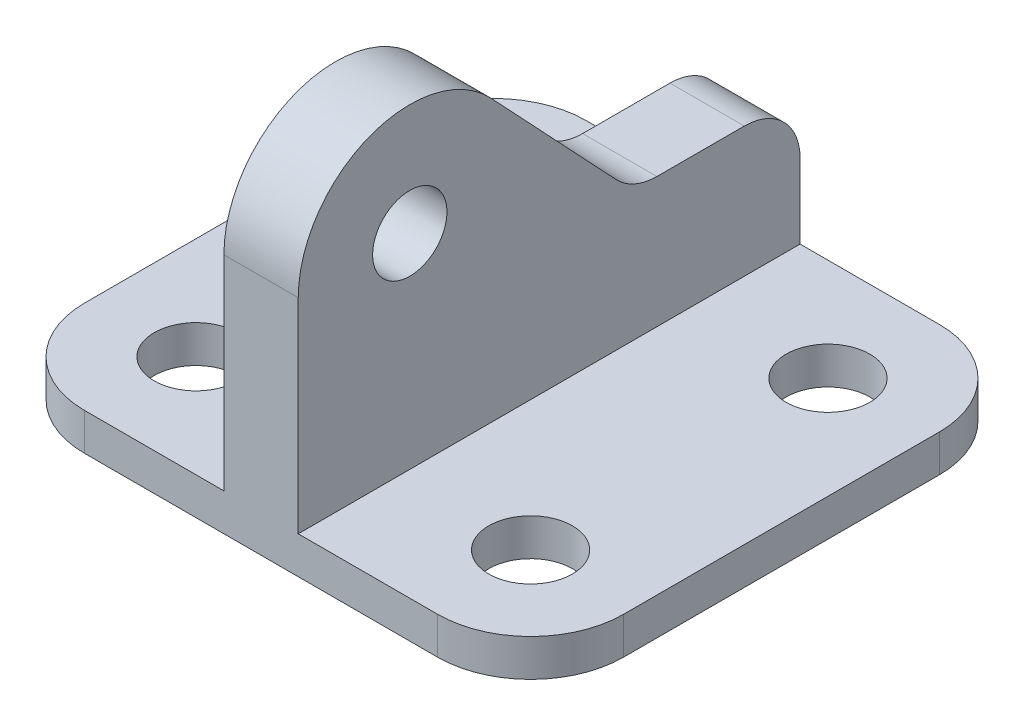
ISO-10303-21;
HEADER;
FILE_DESCRIPTION(('STEP AP214'),'2;1');
FILE_NAME('part.step','',(''),(''),'','','');
FILE_SCHEMA(('AUTOMOTIVE_DESIGN { 1 0 10303 214 1 1 1 1 }'));
ENDSEC;
DATA;
#1=APPLICATION_CONTEXT('core data for automotive mechanical design processes');
#2=APPLICATION_PROTOCOL_DEFINITION('international standard','automotive_design',2000,#1);
#3=PRODUCT_CONTEXT('',#1,'mechanical');
#4=PRODUCT('Part','Part','',(#3));
#5=PRODUCT_RELATED_PRODUCT_CATEGORY('part','',(#4));
#6=PRODUCT_DEFINITION_FORMATION('','',#4);
#7=PRODUCT_DEFINITION_CONTEXT('part definition',#1,'design');
#8=PRODUCT_DEFINITION('design','',#6,#7);
#9=PRODUCT_DEFINITION_SHAPE('','',#8);
#10=(LENGTH_UNIT() NAMED_UNIT(*) SI_UNIT(.MILLI.,.METRE.));
#11=(NAMED_UNIT(*) PLANE_ANGLE_UNIT() SI_UNIT($,.RADIAN.));
#12=(NAMED_UNIT(*) SI_UNIT($,.STERADIAN.) SOLID_ANGLE_UNIT());
#13=UNCERTAINTY_MEASURE_WITH_UNIT(LENGTH_MEASURE(1.E-05),#10,'distance_accuracy_value','');
#14=(GEOMETRIC_REPRESENTATION_CONTEXT(3) GLOBAL_UNCERTAINTY_ASSIGNED_CONTEXT((#13)) GLOBAL_UNIT_ASSIGNED_CONTEXT((#10,
#11,#12)) REPRESENTATION_CONTEXT('',''));
#15=CARTESIAN_POINT('',(0.,0.,0.));
#16=DIRECTION('',(0.,0.,1.));
#17=DIRECTION('',(1.,0.,0.));
#18=AXIS2_PLACEMENT_3D('',#15,#16,#17);
#19=CARTESIAN_POINT('',(0.,2.,27.));
#20=DIRECTION('',(1.,0.,0.));
#21=DIRECTION('',(0.,1.,0.));
#22=AXIS2_PLACEMENT_3D('',#19,#20,#21);
#23=PLANE('',#22);
#24=DIRECTION('',(0.,0.,-1.));
#25=VECTOR('',#24,1.);
#26=CARTESIAN_POINT('',(0.,2.,27.));
#27=LINE('',#26,#25);
#28=CARTESIAN_POINT('',(0.,2.,22.));
#29=VERTEX_POINT('',#28);
#30=CARTESIAN_POINT('',(0.,2.,5.));
#31=VERTEX_POINT('',#30);
#32=EDGE_CURVE('E208',#29,#31,#27,.T.);
#33=ORIENTED_EDGE('',*,*,#32,.T.);
#34=DIRECTION('',(0.,-1.,0.));
#35=VECTOR('',#34,1.);
#36=CARTESIAN_POINT('',(0.,2.,5.));
#37=LINE('',#36,#35);
#38=CARTESIAN_POINT('',(0.,0.,5.));
#39=VERTEX_POINT('',#38);
#40=EDGE_CURVE('E240',#31,#39,#37,.T.);
#41=ORIENTED_EDGE('',*,*,#40,.T.);
#42=DIRECTION('',(0.,0.,-1.));
#43=VECTOR('',#42,1.);
#44=CARTESIAN_POINT('',(0.,0.,27.));
#45=LINE('',#44,#43);
#46=CARTESIAN_POINT('',(0.,0.,22.));
#47=VERTEX_POINT('',#46);
#48=EDGE_CURVE('E235',#47,#39,#45,.T.);
#49=ORIENTED_EDGE('',*,*,#48,.F.);
#50=DIRECTION('',(0.,-1.,0.));
#51=VECTOR('',#50,1.);
#52=CARTESIAN_POINT('',(0.,2.,22.));
#53=LINE('',#52,#51);
#54=EDGE_CURVE('E238',#47,#29,#53,.F.);
#55=ORIENTED_EDGE('',*,*,#54,.T.);
#56=EDGE_LOOP('',(#33,#41,#49,#55));
#57=FACE_BOUND('',#56,.T.);
#58=ADVANCED_FACE('F33',(#57),#23,.F.);
#59=CARTESIAN_POINT('',(0.,0.,27.));
#60=DIRECTION('',(0.,1.,0.));
#61=DIRECTION('',(0.,0.,1.));
#62=AXIS2_PLACEMENT_3D('',#59,#60,#61);
#63=PLANE('',#62);
#64=CARTESIAN_POINT('',(23.5,0.,21.5));
#65=DIRECTION('',(0.,-1.,0.));
#66=DIRECTION('',(0.,0.,-1.));
#67=AXIS2_PLACEMENT_3D('',#64,#65,#66);
#68=CIRCLE('',#67,2.25);
#69=CARTESIAN_POINT('',(23.5,0.,19.25));
#70=VERTEX_POINT('',#69);
#71=EDGE_CURVE('E179',#70,#70,#68,.T.);
#72=ORIENTED_EDGE('',*,*,#71,.F.);
#73=EDGE_LOOP('',(#72));
#74=FACE_BOUND('',#73,.T.);
#75=CARTESIAN_POINT('',(23.5,0.,5.5));
#76=DIRECTION('',(0.,-1.,0.));
#77=DIRECTION('',(0.,0.,-1.));
#78=AXIS2_PLACEMENT_3D('',#75,#76,#77);
#79=CIRCLE('',#78,2.25);
#80=CARTESIAN_POINT('',(23.5,0.,3.25));
#81=VERTEX_POINT('',#80);
#82=EDGE_CURVE('E183',#81,#81,#79,.T.);
#83=ORIENTED_EDGE('',*,*,#82,.F.);
#84=EDGE_LOOP('',(#83));
#85=FACE_BOUND('',#84,.T.);
#86=CARTESIAN_POINT('',(5.5,0.,5.5));
#87=DIRECTION('',(0.,-1.,0.));
#88=DIRECTION('',(0.,0.,-1.));
#89=AXIS2_PLACEMENT_3D('',#86,#87,#88);
#90=CIRCLE('',#89,2.25);
#91=CARTESIAN_POINT('',(5.5,0.,3.25));
#92=VERTEX_POINT('',#91);
#93=EDGE_CURVE('E187',#92,#92,#90,.T.);
#94=ORIENTED_EDGE('',*,*,#93,.F.);
#95=EDGE_LOOP('',(#94));
#96=FACE_BOUND('',#95,.T.);
#97=CARTESIAN_POINT('',(5.49999999999999,0.,21.5));
#98=DIRECTION('',(0.,-1.,0.));
#99=DIRECTION('',(0.,0.,-1.));
#100=AXIS2_PLACEMENT_3D('',#97,#98,#99);
#101=CIRCLE('',#100,2.25);
#102=CARTESIAN_POINT('',(5.49999999999999,0.,19.25));
#103=VERTEX_POINT('',#102);
#104=EDGE_CURVE('E191',#103,#103,#101,.T.);
#105=ORIENTED_EDGE('',*,*,#104,.F.);
#106=EDGE_LOOP('',(#105));
#107=FACE_BOUND('',#106,.T.);
#108=ORIENTED_EDGE('',*,*,#48,.T.);
#109=CARTESIAN_POINT('',(5.,0.,5.));
#110=DIRECTION('',(0.,1.,0.));
#111=DIRECTION('',(0.,0.,1.));
#112=AXIS2_PLACEMENT_3D('',#109,#110,#111);
#113=CIRCLE('',#112,5.);
#114=CARTESIAN_POINT('',(5.,0.,0.));
#115=VERTEX_POINT('',#114);
#116=EDGE_CURVE('E249',#39,#115,#113,.F.);
#117=ORIENTED_EDGE('',*,*,#116,.T.);
#118=DIRECTION('',(1.,0.,0.));
#119=VECTOR('',#118,1.);
#120=CARTESIAN_POINT('',(0.,0.,0.));
#121=LINE('',#120,#119);
#122=CARTESIAN_POINT('',(24.,0.,0.));
#123=VERTEX_POINT('',#122);
#124=EDGE_CURVE('E209',#115,#123,#121,.T.);
#125=ORIENTED_EDGE('',*,*,#124,.T.);
#126=CARTESIAN_POINT('',(24.,0.,5.));
#127=DIRECTION('',(0.,1.,0.));
#128=DIRECTION('',(0.,0.,1.));
#129=AXIS2_PLACEMENT_3D('',#126,#127,#128);
#130=CIRCLE('',#129,5.);
#131=CARTESIAN_POINT('',(29.,0.,5.));
#132=VERTEX_POINT('',#131);
#133=EDGE_CURVE('E247',#123,#132,#130,.F.);
#134=ORIENTED_EDGE('',*,*,#133,.T.);
#135=DIRECTION('',(0.,0.,-1.));
#136=VECTOR('',#135,1.);
#137=CARTESIAN_POINT('',(29.,0.,27.));
#138=LINE('',#137,#136);
#139=CARTESIAN_POINT('',(29.,0.,22.));
#140=VERTEX_POINT('',#139);
#141=EDGE_CURVE('E232',#140,#132,#138,.T.);
#142=ORIENTED_EDGE('',*,*,#141,.F.);
#143=CARTESIAN_POINT('',(24.,0.,22.));
#144=DIRECTION('',(0.,1.,0.));
#145=DIRECTION('',(0.,0.,1.));
#146=AXIS2_PLACEMENT_3D('',#143,#144,#145);
#147=CIRCLE('',#146,5.);
#148=CARTESIAN_POINT('',(24.,0.,27.));
#149=VERTEX_POINT('',#148);
#150=EDGE_CURVE('E245',#140,#149,#147,.F.);
#151=ORIENTED_EDGE('',*,*,#150,.T.);
#152=DIRECTION('',(1.,0.,0.));
#153=VECTOR('',#152,1.);
#154=CARTESIAN_POINT('',(0.,0.,27.));
#155=LINE('',#154,#153);
#156=CARTESIAN_POINT('',(5.,0.,27.));
#157=VERTEX_POINT('',#156);
#158=EDGE_CURVE('E195',#157,#149,#155,.T.);
#159=ORIENTED_EDGE('',*,*,#158,.F.);
#160=CARTESIAN_POINT('',(5.,0.,22.));
#161=DIRECTION('',(0.,1.,0.));
#162=DIRECTION('',(0.,0.,1.));
#163=AXIS2_PLACEMENT_3D('',#160,#161,#162);
#164=CIRCLE('',#163,5.);
#165=EDGE_CURVE('E243',#157,#47,#164,.F.);
#166=ORIENTED_EDGE('',*,*,#165,.T.);
#167=EDGE_LOOP('',(#108,#117,#125,#134,#142,#151,#159,#166));
#168=FACE_BOUND('',#167,.T.);
#169=ADVANCED_FACE('F321',(#74,#85,#96,#107,#168),#63,.F.);
#170=CARTESIAN_POINT('',(29.,0.,27.));
#171=DIRECTION('',(-1.,0.,0.));
#172=DIRECTION('',(0.,0.,1.));
#173=AXIS2_PLACEMENT_3D('',#170,#171,#172);
#174=PLANE('',#173);
#175=ORIENTED_EDGE('',*,*,#141,.T.);
#176=DIRECTION('',(0.,1.,0.));
#177=VECTOR('',#176,1.);
#178=CARTESIAN_POINT('',(29.,0.,5.));
#179=LINE('',#178,#177);
#180=CARTESIAN_POINT('',(29.,2.,5.));
#181=VERTEX_POINT('',#180);
#182=EDGE_CURVE('E261',#132,#181,#179,.T.);
#183=ORIENTED_EDGE('',*,*,#182,.T.);
#184=DIRECTION('',(0.,0.,-1.));
#185=VECTOR('',#184,1.);
#186=CARTESIAN_POINT('',(29.,2.,27.));
#187=LINE('',#186,#185);
#188=CARTESIAN_POINT('',(29.,2.,22.));
#189=VERTEX_POINT('',#188);
#190=EDGE_CURVE('E229',#189,#181,#187,.T.);
#191=ORIENTED_EDGE('',*,*,#190,.F.);
#192=DIRECTION('',(0.,1.,0.));
#193=VECTOR('',#192,1.);
#194=CARTESIAN_POINT('',(29.,0.,22.));
#195=LINE('',#194,#193);
#196=EDGE_CURVE('E259',#189,#140,#195,.F.);
#197=ORIENTED_EDGE('',*,*,#196,.T.);
#198=EDGE_LOOP('',(#175,#183,#191,#197));
#199=FACE_BOUND('',#198,.T.);
#200=ADVANCED_FACE('F324',(#199),#174,.F.);
#201=CARTESIAN_POINT('',(29.,2.,27.));
#202=DIRECTION('',(0.,-1.,0.));
#203=DIRECTION('',(1.,0.,0.));
#204=AXIS2_PLACEMENT_3D('',#201,#202,#203);
#205=PLANE('',#204);
#206=CARTESIAN_POINT('',(23.5,2.00000000000001,21.5));
#207=DIRECTION('',(0.,-1.,0.));
#208=DIRECTION('',(1.,0.,0.));
#209=AXIS2_PLACEMENT_3D('',#206,#207,#208);
#210=CIRCLE('',#209,2.25);
#211=CARTESIAN_POINT('',(25.75,2.00000000000001,21.5));
#212=VERTEX_POINT('',#211);
#213=EDGE_CURVE('E182',#212,#212,#210,.T.);
#214=ORIENTED_EDGE('',*,*,#213,.T.);
#215=EDGE_LOOP('',(#214));
#216=FACE_BOUND('',#215,.T.);
#217=CARTESIAN_POINT('',(23.5,2.00000000000001,5.5));
#218=DIRECTION('',(0.,-1.,0.));
#219=DIRECTION('',(1.,0.,0.));
#220=AXIS2_PLACEMENT_3D('',#217,#218,#219);
#221=CIRCLE('',#220,2.25);
#222=CARTESIAN_POINT('',(25.75,2.00000000000001,5.5));
#223=VERTEX_POINT('',#222);
#224=EDGE_CURVE('E186',#223,#223,#221,.T.);
#225=ORIENTED_EDGE('',*,*,#224,.T.);
#226=EDGE_LOOP('',(#225));
#227=FACE_BOUND('',#226,.T.);
#228=ORIENTED_EDGE('',*,*,#190,.T.);
#229=CARTESIAN_POINT('',(24.,2.,5.));
#230=DIRECTION('',(0.,-1.,0.));
#231=DIRECTION('',(1.,0.,0.));
#232=AXIS2_PLACEMENT_3D('',#229,#230,#231);
#233=CIRCLE('',#232,5.);
#234=CARTESIAN_POINT('',(24.,2.,0.));
#235=VERTEX_POINT('',#234);
#236=EDGE_CURVE('E266',#181,#235,#233,.F.);
#237=ORIENTED_EDGE('',*,*,#236,.T.);
#238=DIRECTION('',(-1.,0.,0.));
#239=VECTOR('',#238,1.);
#240=CARTESIAN_POINT('',(29.,2.,0.));
#241=LINE('',#240,#239);
#242=CARTESIAN_POINT('',(16.5,2.,0.));
#243=VERTEX_POINT('',#242);
#244=EDGE_CURVE('E212',#235,#243,#241,.T.);
#245=ORIENTED_EDGE('',*,*,#244,.T.);
#246=DIRECTION('',(0.,0.,-1.));
#247=VECTOR('',#246,1.);
#248=CARTESIAN_POINT('',(16.5,2.,27.));
#249=LINE('',#248,#247);
#250=CARTESIAN_POINT('',(16.5,2.,27.));
#251=VERTEX_POINT('',#250);
#252=EDGE_CURVE('E226',#251,#243,#249,.T.);
#253=ORIENTED_EDGE('',*,*,#252,.F.);
#254=DIRECTION('',(-1.,0.,0.));
#255=VECTOR('',#254,1.);
#256=CARTESIAN_POINT('',(29.,2.,27.));
#257=LINE('',#256,#255);
#258=CARTESIAN_POINT('',(24.,2.,27.));
#259=VERTEX_POINT('',#258);
#260=EDGE_CURVE('E198',#259,#251,#257,.T.);
#261=ORIENTED_EDGE('',*,*,#260,.F.);
#262=CARTESIAN_POINT('',(24.,2.,22.));
#263=DIRECTION('',(0.,-1.,0.));
#264=DIRECTION('',(1.,0.,0.));
#265=AXIS2_PLACEMENT_3D('',#262,#263,#264);
#266=CIRCLE('',#265,5.);
#267=EDGE_CURVE('E264',#259,#189,#266,.F.);
#268=ORIENTED_EDGE('',*,*,#267,.T.);
#269=EDGE_LOOP('',(#228,#237,#245,#253,#261,#268));
#270=FACE_BOUND('',#269,.T.);
#271=ADVANCED_FACE('F312',(#216,#227,#270),#205,.F.);
#272=CARTESIAN_POINT('',(16.5,2.,27.));
#273=DIRECTION('',(-1.,0.,0.));
#274=DIRECTION('',(0.,0.,1.));
#275=AXIS2_PLACEMENT_3D('',#272,#273,#274);
#276=PLANE('',#275);
#277=CARTESIAN_POINT('',(16.5,13.,21.));
#278=DIRECTION('',(-1.,0.,0.));
#279=DIRECTION('',(0.,0.,1.));
#280=AXIS2_PLACEMENT_3D('',#277,#278,#279);
#281=CIRCLE('',#280,2.);
#282=CARTESIAN_POINT('',(16.5,13.,23.));
#283=VERTEX_POINT('',#282);
#284=EDGE_CURVE('E298',#283,#283,#281,.T.);
#285=ORIENTED_EDGE('',*,*,#284,.T.);
#286=EDGE_LOOP('',(#285));
#287=FACE_BOUND('',#286,.T.);
#288=DIRECTION('',(0.,1.,0.));
#289=VECTOR('',#288,1.);
#290=CARTESIAN_POINT('',(16.5,2.,0.));
#291=LINE('',#290,#289);
#292=CARTESIAN_POINT('',(16.5,6.,0.));
#293=VERTEX_POINT('',#292);
#294=EDGE_CURVE('E214',#243,#293,#291,.T.);
#295=ORIENTED_EDGE('',*,*,#294,.T.);
#296=CARTESIAN_POINT('',(16.5,6.,3.));
#297=DIRECTION('',(-1.,0.,0.));
#298=DIRECTION('',(0.,0.,1.));
#299=AXIS2_PLACEMENT_3D('',#296,#297,#298);
#300=CIRCLE('',#299,3.);
#301=CARTESIAN_POINT('',(16.5,9.,3.));
#302=VERTEX_POINT('',#301);
#303=EDGE_CURVE('E48',#293,#302,#300,.F.);
#304=ORIENTED_EDGE('',*,*,#303,.T.);
#305=DIRECTION('',(0.,0.,1.));
#306=VECTOR('',#305,1.);
#307=CARTESIAN_POINT('',(16.5,9.,27.));
#308=LINE('',#307,#306);
#309=CARTESIAN_POINT('',(16.5,9.,7.70329308849007));
#310=VERTEX_POINT('',#309);
#311=EDGE_CURVE('E165',#302,#310,#308,.T.);
#312=ORIENTED_EDGE('',*,*,#311,.T.);
#313=CARTESIAN_POINT('',(16.5,12.,7.70329308849007));
#314=DIRECTION('',(-1.,0.,0.));
#315=DIRECTION('',(0.,0.,1.));
#316=AXIS2_PLACEMENT_3D('',#313,#314,#315);
#317=CIRCLE('',#316,3.);
#318=CARTESIAN_POINT('',(16.5,9.94450603672649,9.88845774291457));
#319=VERTEX_POINT('',#318);
#320=EDGE_CURVE('E11',#310,#319,#317,.T.);
#321=ORIENTED_EDGE('',*,*,#320,.T.);
#322=DIRECTION('',(0.,0.728388218141501,0.685164654424503));
#323=VECTOR('',#322,1.);
#324=CARTESIAN_POINT('',(16.5,14.269339737565,13.9566498337191));
#325=LINE('',#324,#323);
#326=CARTESIAN_POINT('',(16.5,17.110987926547,16.629670691151));
#327=VERTEX_POINT('',#326);
#328=EDGE_CURVE('E177',#319,#327,#325,.T.);
#329=ORIENTED_EDGE('',*,*,#328,.T.);
#330=CARTESIAN_POINT('',(16.5,13.,21.));
#331=DIRECTION('',(-1.,0.,0.));
#332=DIRECTION('',(0.,0.,1.));
#333=AXIS2_PLACEMENT_3D('',#330,#331,#332);
#334=CIRCLE('',#333,6.);
#335=CARTESIAN_POINT('',(16.5,13.,27.));
#336=VERTEX_POINT('',#335);
#337=EDGE_CURVE('E164',#327,#336,#334,.F.);
#338=ORIENTED_EDGE('',*,*,#337,.T.);
#339=DIRECTION('',(0.,1.,0.));
#340=VECTOR('',#339,1.);
#341=CARTESIAN_POINT('',(16.5,2.,27.));
#342=LINE('',#341,#340);
#343=EDGE_CURVE('E201',#251,#336,#342,.T.);
#344=ORIENTED_EDGE('',*,*,#343,.F.);
#345=ORIENTED_EDGE('',*,*,#252,.T.);
#346=EDGE_LOOP('',(#295,#304,#312,#321,#329,#338,#344,#345));
#347=FACE_BOUND('',#346,.T.);
#348=ADVANCED_FACE('F302',(#287,#347),#276,.F.);
#349=CARTESIAN_POINT('',(12.5,19.,27.));
#350=DIRECTION('',(1.,0.,0.));
#351=DIRECTION('',(0.,0.,-1.));
#352=AXIS2_PLACEMENT_3D('',#349,#350,#351);
#353=PLANE('',#352);
#354=CARTESIAN_POINT('',(12.5,13.,21.));
#355=DIRECTION('',(-1.,0.,0.));
#356=DIRECTION('',(0.,0.,1.));
#357=AXIS2_PLACEMENT_3D('',#354,#355,#356);
#358=CIRCLE('',#357,2.);
#359=CARTESIAN_POINT('',(12.5,13.,23.));
#360=VERTEX_POINT('',#359);
#361=EDGE_CURVE('E555',#360,#360,#358,.T.);
#362=ORIENTED_EDGE('',*,*,#361,.F.);
#363=EDGE_LOOP('',(#362));
#364=FACE_BOUND('',#363,.T.);
#365=DIRECTION('',(0.,0.,1.));
#366=VECTOR('',#365,1.);
#367=CARTESIAN_POINT('',(12.5,9.,0.));
#368=LINE('',#367,#366);
#369=CARTESIAN_POINT('',(12.5,9.,3.));
#370=VERTEX_POINT('',#369);
#371=CARTESIAN_POINT('',(12.5,9.,7.70329308849007));
#372=VERTEX_POINT('',#371);
#373=EDGE_CURVE('E157',#370,#372,#368,.T.);
#374=ORIENTED_EDGE('',*,*,#373,.F.);
#375=CARTESIAN_POINT('',(12.5,6.,3.));
#376=DIRECTION('',(1.,0.,0.));
#377=DIRECTION('',(0.,0.,-1.));
#378=AXIS2_PLACEMENT_3D('',#375,#376,#377);
#379=CIRCLE('',#378,3.);
#380=CARTESIAN_POINT('',(12.5,6.,0.));
#381=VERTEX_POINT('',#380);
#382=EDGE_CURVE('E56',#370,#381,#379,.F.);
#383=ORIENTED_EDGE('',*,*,#382,.T.);
#384=DIRECTION('',(0.,-1.,0.));
#385=VECTOR('',#384,1.);
#386=CARTESIAN_POINT('',(12.5,19.,0.));
#387=LINE('',#386,#385);
#388=CARTESIAN_POINT('',(12.5,2.,0.));
#389=VERTEX_POINT('',#388);
#390=EDGE_CURVE('E217',#381,#389,#387,.T.);
#391=ORIENTED_EDGE('',*,*,#390,.T.);
#392=DIRECTION('',(0.,0.,-1.));
#393=VECTOR('',#392,1.);
#394=CARTESIAN_POINT('',(12.5,2.,27.));
#395=LINE('',#394,#393);
#396=CARTESIAN_POINT('',(12.5,2.,27.));
#397=VERTEX_POINT('',#396);
#398=EDGE_CURVE('E223',#397,#389,#395,.T.);
#399=ORIENTED_EDGE('',*,*,#398,.F.);
#400=DIRECTION('',(0.,-1.,0.));
#401=VECTOR('',#400,1.);
#402=CARTESIAN_POINT('',(12.5,19.,27.));
#403=LINE('',#402,#401);
#404=CARTESIAN_POINT('',(12.5,13.,27.));
#405=VERTEX_POINT('',#404);
#406=EDGE_CURVE('E170',#405,#397,#403,.T.);
#407=ORIENTED_EDGE('',*,*,#406,.F.);
#408=CARTESIAN_POINT('',(12.5,13.,21.));
#409=DIRECTION('',(1.,0.,0.));
#410=DIRECTION('',(0.,0.,1.));
#411=AXIS2_PLACEMENT_3D('',#408,#409,#410);
#412=CIRCLE('',#411,6.);
#413=CARTESIAN_POINT('',(12.5,17.110987926547,16.629670691151));
#414=VERTEX_POINT('',#413);
#415=EDGE_CURVE('E156',#414,#405,#412,.T.);
#416=ORIENTED_EDGE('',*,*,#415,.F.);
#417=DIRECTION('',(0.,0.728388218141501,0.685164654424503));
#418=VECTOR('',#417,1.);
#419=CARTESIAN_POINT('',(12.5,9.,9.));
#420=LINE('',#419,#418);
#421=CARTESIAN_POINT('',(12.5,9.94450603672649,9.88845774291457));
#422=VERTEX_POINT('',#421);
#423=EDGE_CURVE('E148',#422,#414,#420,.T.);
#424=ORIENTED_EDGE('',*,*,#423,.F.);
#425=CARTESIAN_POINT('',(12.5,12.,7.70329308849007));
#426=DIRECTION('',(1.,0.,0.));
#427=DIRECTION('',(0.,0.,-1.));
#428=AXIS2_PLACEMENT_3D('',#425,#426,#427);
#429=CIRCLE('',#428,3.);
#430=EDGE_CURVE('E41',#422,#372,#429,.T.);
#431=ORIENTED_EDGE('',*,*,#430,.T.);
#432=EDGE_LOOP('',(#374,#383,#391,#399,#407,#416,#424,#431));
#433=FACE_BOUND('',#432,.T.);
#434=ADVANCED_FACE('F168',(#364,#433),#353,.F.);
#435=CARTESIAN_POINT('',(12.5,2.,27.));
#436=DIRECTION('',(0.,-1.,0.));
#437=DIRECTION('',(1.,0.,0.));
#438=AXIS2_PLACEMENT_3D('',#435,#436,#437);
#439=PLANE('',#438);
#440=CARTESIAN_POINT('',(5.5,2.,5.5));
#441=DIRECTION('',(0.,-1.,0.));
#442=DIRECTION('',(1.,0.,0.));
#443=AXIS2_PLACEMENT_3D('',#440,#441,#442);
#444=CIRCLE('',#443,2.25);
#445=CARTESIAN_POINT('',(7.74999999999999,2.,5.5));
#446=VERTEX_POINT('',#445);
#447=EDGE_CURVE('E190',#446,#446,#444,.T.);
#448=ORIENTED_EDGE('',*,*,#447,.T.);
#449=EDGE_LOOP('',(#448));
#450=FACE_BOUND('',#449,.T.);
#451=CARTESIAN_POINT('',(5.49999999999999,2.,21.5));
#452=DIRECTION('',(0.,-1.,0.));
#453=DIRECTION('',(1.,0.,0.));
#454=AXIS2_PLACEMENT_3D('',#451,#452,#453);
#455=CIRCLE('',#454,2.25);
#456=CARTESIAN_POINT('',(7.74999999999999,2.,21.5));
#457=VERTEX_POINT('',#456);
#458=EDGE_CURVE('E194',#457,#457,#455,.T.);
#459=ORIENTED_EDGE('',*,*,#458,.T.);
#460=EDGE_LOOP('',(#459));
#461=FACE_BOUND('',#460,.T.);
#462=DIRECTION('',(-1.,0.,0.));
#463=VECTOR('',#462,1.);
#464=CARTESIAN_POINT('',(12.5,2.,0.));
#465=LINE('',#464,#463);
#466=CARTESIAN_POINT('',(5.,2.,0.));
#467=VERTEX_POINT('',#466);
#468=EDGE_CURVE('E199',#389,#467,#465,.T.);
#469=ORIENTED_EDGE('',*,*,#468,.T.);
#470=CARTESIAN_POINT('',(5.,2.,5.));
#471=DIRECTION('',(0.,-1.,0.));
#472=DIRECTION('',(1.,0.,0.));
#473=AXIS2_PLACEMENT_3D('',#470,#471,#472);
#474=CIRCLE('',#473,5.);
#475=EDGE_CURVE('E257',#467,#31,#474,.F.);
#476=ORIENTED_EDGE('',*,*,#475,.T.);
#477=ORIENTED_EDGE('',*,*,#32,.F.);
#478=CARTESIAN_POINT('',(5.,2.,22.));
#479=DIRECTION('',(0.,-1.,0.));
#480=DIRECTION('',(1.,0.,0.));
#481=AXIS2_PLACEMENT_3D('',#478,#479,#480);
#482=CIRCLE('',#481,5.);
#483=CARTESIAN_POINT('',(5.,2.,27.));
#484=VERTEX_POINT('',#483);
#485=EDGE_CURVE('E255',#29,#484,#482,.F.);
#486=ORIENTED_EDGE('',*,*,#485,.T.);
#487=DIRECTION('',(-1.,0.,0.));
#488=VECTOR('',#487,1.);
#489=CARTESIAN_POINT('',(12.5,2.,27.));
#490=LINE('',#489,#488);
#491=EDGE_CURVE('E205',#397,#484,#490,.T.);
#492=ORIENTED_EDGE('',*,*,#491,.F.);
#493=ORIENTED_EDGE('',*,*,#398,.T.);
#494=EDGE_LOOP('',(#469,#476,#477,#486,#492,#493));
#495=FACE_BOUND('',#494,.T.);
#496=ADVANCED_FACE('F348',(#450,#461,#495),#439,.F.);
#497=CARTESIAN_POINT('',(0.,0.,27.));
#498=DIRECTION('',(0.,0.,1.));
#499=DIRECTION('',(1.,0.,0.));
#500=AXIS2_PLACEMENT_3D('',#497,#498,#499);
#501=PLANE('',#500);
#502=DIRECTION('',(-1.,0.,0.));
#503=VECTOR('',#502,1.);
#504=CARTESIAN_POINT('',(39.5,13.,27.));
#505=LINE('',#504,#503);
#506=EDGE_CURVE('E274',#405,#336,#505,.F.);
#507=ORIENTED_EDGE('',*,*,#506,.F.);
#508=ORIENTED_EDGE('',*,*,#406,.T.);
#509=ORIENTED_EDGE('',*,*,#491,.T.);
#510=DIRECTION('',(0.,-1.,0.));
#511=VECTOR('',#510,1.);
#512=CARTESIAN_POINT('',(5.,0.,27.));
#513=LINE('',#512,#511);
#514=EDGE_CURVE('E268',#484,#157,#513,.T.);
#515=ORIENTED_EDGE('',*,*,#514,.T.);
#516=ORIENTED_EDGE('',*,*,#158,.T.);
#517=DIRECTION('',(0.,1.,0.));
#518=VECTOR('',#517,1.);
#519=CARTESIAN_POINT('',(24.,2.,27.));
#520=LINE('',#519,#518);
#521=EDGE_CURVE('E271',#149,#259,#520,.T.);
#522=ORIENTED_EDGE('',*,*,#521,.T.);
#523=ORIENTED_EDGE('',*,*,#260,.T.);
#524=ORIENTED_EDGE('',*,*,#343,.T.);
#525=EDGE_LOOP('',(#507,#508,#509,#515,#516,#522,#523,#524));
#526=FACE_BOUND('',#525,.T.);
#527=ADVANCED_FACE('F332',(#526),#501,.T.);
#528=CARTESIAN_POINT('',(0.,0.,0.));
#529=DIRECTION('',(0.,0.,1.));
#530=DIRECTION('',(1.,0.,0.));
#531=AXIS2_PLACEMENT_3D('',#528,#529,#530);
#532=PLANE('',#531);
#533=ORIENTED_EDGE('',*,*,#390,.F.);
#534=DIRECTION('',(1.,0.,0.));
#535=VECTOR('',#534,1.);
#536=CARTESIAN_POINT('',(0.,6.,0.));
#537=LINE('',#536,#535);
#538=EDGE_CURVE('E289',#381,#293,#537,.T.);
#539=ORIENTED_EDGE('',*,*,#538,.T.);
#540=ORIENTED_EDGE('',*,*,#294,.F.);
#541=ORIENTED_EDGE('',*,*,#244,.F.);
#542=DIRECTION('',(0.,1.,0.));
#543=VECTOR('',#542,1.);
#544=CARTESIAN_POINT('',(24.,0.,0.));
#545=LINE('',#544,#543);
#546=EDGE_CURVE('E251',#235,#123,#545,.F.);
#547=ORIENTED_EDGE('',*,*,#546,.T.);
#548=ORIENTED_EDGE('',*,*,#124,.F.);
#549=DIRECTION('',(0.,-1.,0.));
#550=VECTOR('',#549,1.);
#551=CARTESIAN_POINT('',(5.,0.,0.));
#552=LINE('',#551,#550);
#553=EDGE_CURVE('E253',#115,#467,#552,.F.);
#554=ORIENTED_EDGE('',*,*,#553,.T.);
#555=ORIENTED_EDGE('',*,*,#468,.F.);
#556=EDGE_LOOP('',(#533,#539,#540,#541,#547,#548,#554,#555));
#557=FACE_BOUND('',#556,.T.);
#558=ADVANCED_FACE('F305',(#557),#532,.F.);
#559=CARTESIAN_POINT('',(5.,2.,5.));
#560=DIRECTION('',(0.,-1.,0.));
#561=DIRECTION('',(1.,0.,0.));
#562=AXIS2_PLACEMENT_3D('',#559,#560,#561);
#563=CYLINDRICAL_SURFACE('',#562,5.);
#564=ORIENTED_EDGE('',*,*,#475,.F.);
#565=ORIENTED_EDGE('',*,*,#553,.F.);
#566=ORIENTED_EDGE('',*,*,#116,.F.);
#567=ORIENTED_EDGE('',*,*,#40,.F.);
#568=EDGE_LOOP('',(#564,#565,#566,#567));
#569=FACE_BOUND('',#568,.T.);
#570=ADVANCED_FACE('F345',(#569),#563,.T.);
#571=CARTESIAN_POINT('',(24.,0.,5.));
#572=DIRECTION('',(0.,1.,0.));
#573=DIRECTION('',(0.,0.,1.));
#574=AXIS2_PLACEMENT_3D('',#571,#572,#573);
#575=CYLINDRICAL_SURFACE('',#574,5.);
#576=ORIENTED_EDGE('',*,*,#133,.F.);
#577=ORIENTED_EDGE('',*,*,#546,.F.);
#578=ORIENTED_EDGE('',*,*,#236,.F.);
#579=ORIENTED_EDGE('',*,*,#182,.F.);
#580=EDGE_LOOP('',(#576,#577,#578,#579));
#581=FACE_BOUND('',#580,.T.);
#582=ADVANCED_FACE('F317',(#581),#575,.T.);
#583=CARTESIAN_POINT('',(24.,0.,22.));
#584=DIRECTION('',(0.,-1.,0.));
#585=DIRECTION('',(0.,0.,-1.));
#586=AXIS2_PLACEMENT_3D('',#583,#584,#585);
#587=CYLINDRICAL_SURFACE('',#586,5.);
#588=ORIENTED_EDGE('',*,*,#150,.F.);
#589=ORIENTED_EDGE('',*,*,#196,.F.);
#590=ORIENTED_EDGE('',*,*,#267,.F.);
#591=ORIENTED_EDGE('',*,*,#521,.F.);
#592=EDGE_LOOP('',(#588,#589,#590,#591));
#593=FACE_BOUND('',#592,.T.);
#594=ADVANCED_FACE('F328',(#593),#587,.T.);
#595=CARTESIAN_POINT('',(5.,0.,22.));
#596=DIRECTION('',(0.,1.,0.));
#597=DIRECTION('',(-1.,0.,0.));
#598=AXIS2_PLACEMENT_3D('',#595,#596,#597);
#599=CYLINDRICAL_SURFACE('',#598,5.);
#600=ORIENTED_EDGE('',*,*,#485,.F.);
#601=ORIENTED_EDGE('',*,*,#54,.F.);
#602=ORIENTED_EDGE('',*,*,#165,.F.);
#603=ORIENTED_EDGE('',*,*,#514,.F.);
#604=EDGE_LOOP('',(#600,#601,#602,#603));
#605=FACE_BOUND('',#604,.T.);
#606=ADVANCED_FACE('F337',(#605),#599,.T.);
#607=CARTESIAN_POINT('',(5.49999999999999,19.,21.5));
#608=DIRECTION('',(0.,-1.,0.));
#609=DIRECTION('',(0.,0.,-1.));
#610=AXIS2_PLACEMENT_3D('',#607,#608,#609);
#611=CYLINDRICAL_SURFACE('',#610,2.25);
#612=ORIENTED_EDGE('',*,*,#104,.T.);
#613=EDGE_LOOP('',(#612));
#614=FACE_BOUND('',#613,.T.);
#615=ORIENTED_EDGE('',*,*,#458,.F.);
#616=EDGE_LOOP('',(#615));
#617=FACE_BOUND('',#616,.T.);
#618=ADVANCED_FACE('F377',(#614,#617),#611,.F.);
#619=CARTESIAN_POINT('',(5.5,19.,5.5));
#620=DIRECTION('',(0.,-1.,0.));
#621=DIRECTION('',(0.,0.,-1.));
#622=AXIS2_PLACEMENT_3D('',#619,#620,#621);
#623=CYLINDRICAL_SURFACE('',#622,2.25);
#624=ORIENTED_EDGE('',*,*,#93,.T.);
#625=EDGE_LOOP('',(#624));
#626=FACE_BOUND('',#625,.T.);
#627=ORIENTED_EDGE('',*,*,#447,.F.);
#628=EDGE_LOOP('',(#627));
#629=FACE_BOUND('',#628,.T.);
#630=ADVANCED_FACE('F398',(#626,#629),#623,.F.);
#631=CARTESIAN_POINT('',(23.5,19.,5.5));
#632=DIRECTION('',(0.,-1.,0.));
#633=DIRECTION('',(0.,0.,-1.));
#634=AXIS2_PLACEMENT_3D('',#631,#632,#633);
#635=CYLINDRICAL_SURFACE('',#634,2.25);
#636=ORIENTED_EDGE('',*,*,#82,.T.);
#637=EDGE_LOOP('',(#636));
#638=FACE_BOUND('',#637,.T.);
#639=ORIENTED_EDGE('',*,*,#224,.F.);
#640=EDGE_LOOP('',(#639));
#641=FACE_BOUND('',#640,.T.);
#642=ADVANCED_FACE('F394',(#638,#641),#635,.F.);
#643=CARTESIAN_POINT('',(23.5,19.,21.5));
#644=DIRECTION('',(0.,-1.,0.));
#645=DIRECTION('',(0.,0.,-1.));
#646=AXIS2_PLACEMENT_3D('',#643,#644,#645);
#647=CYLINDRICAL_SURFACE('',#646,2.25);
#648=ORIENTED_EDGE('',*,*,#71,.T.);
#649=EDGE_LOOP('',(#648));
#650=FACE_BOUND('',#649,.T.);
#651=ORIENTED_EDGE('',*,*,#213,.F.);
#652=EDGE_LOOP('',(#651));
#653=FACE_BOUND('',#652,.T.);
#654=ADVANCED_FACE('F391',(#650,#653),#647,.F.);
#655=CARTESIAN_POINT('',(39.5,9.,9.));
#656=DIRECTION('',(0.,-0.685164654424503,0.728388218141501));
#657=DIRECTION('',(0.,-0.728388218141501,-0.685164654424503));
#658=AXIS2_PLACEMENT_3D('',#655,#656,#657);
#659=PLANE('',#658);
#660=ORIENTED_EDGE('',*,*,#328,.F.);
#661=DIRECTION('',(-1.,0.,0.));
#662=VECTOR('',#661,1.);
#663=CARTESIAN_POINT('',(12.5,9.94450603672649,9.88845774291457));
#664=LINE('',#663,#662);
#665=EDGE_CURVE('E154',#319,#422,#664,.T.);
#666=ORIENTED_EDGE('',*,*,#665,.T.);
#667=ORIENTED_EDGE('',*,*,#423,.T.);
#668=DIRECTION('',(-1.,0.,0.));
#669=VECTOR('',#668,1.);
#670=CARTESIAN_POINT('',(39.5,17.110987926547,16.629670691151));
#671=LINE('',#670,#669);
#672=EDGE_CURVE('E152',#327,#414,#671,.T.);
#673=ORIENTED_EDGE('',*,*,#672,.F.);
#674=EDGE_LOOP('',(#660,#666,#667,#673));
#675=FACE_BOUND('',#674,.T.);
#676=ADVANCED_FACE('F151',(#675),#659,.F.);
#677=CARTESIAN_POINT('',(39.5,13.,21.));
#678=DIRECTION('',(-1.,0.,0.));
#679=DIRECTION('',(0.,0.,1.));
#680=AXIS2_PLACEMENT_3D('',#677,#678,#679);
#681=CYLINDRICAL_SURFACE('',#680,6.);
#682=ORIENTED_EDGE('',*,*,#672,.T.);
#683=ORIENTED_EDGE('',*,*,#415,.T.);
#684=ORIENTED_EDGE('',*,*,#506,.T.);
#685=ORIENTED_EDGE('',*,*,#337,.F.);
#686=EDGE_LOOP('',(#682,#683,#684,#685));
#687=FACE_BOUND('',#686,.T.);
#688=ADVANCED_FACE('F161',(#687),#681,.T.);
#689=CARTESIAN_POINT('',(39.5,9.,0.));
#690=DIRECTION('',(0.,-1.,0.));
#691=DIRECTION('',(0.,0.,-1.));
#692=AXIS2_PLACEMENT_3D('',#689,#690,#691);
#693=PLANE('',#692);
#694=ORIENTED_EDGE('',*,*,#373,.T.);
#695=DIRECTION('',(-1.,0.,0.));
#696=VECTOR('',#695,1.);
#697=CARTESIAN_POINT('',(16.5,9.,7.70329308849007));
#698=LINE('',#697,#696);
#699=EDGE_CURVE('E287',#372,#310,#698,.F.);
#700=ORIENTED_EDGE('',*,*,#699,.T.);
#701=ORIENTED_EDGE('',*,*,#311,.F.);
#702=DIRECTION('',(1.,0.,0.));
#703=VECTOR('',#702,1.);
#704=CARTESIAN_POINT('',(39.5,9.,3.));
#705=LINE('',#704,#703);
#706=EDGE_CURVE('E285',#302,#370,#705,.F.);
#707=ORIENTED_EDGE('',*,*,#706,.T.);
#708=EDGE_LOOP('',(#694,#700,#701,#707));
#709=FACE_BOUND('',#708,.T.);
#710=ADVANCED_FACE('F296',(#709),#693,.F.);
#711=CARTESIAN_POINT('',(39.5,12.,7.70329308849007));
#712=DIRECTION('',(1.,0.,0.));
#713=DIRECTION('',(0.,0.,-1.));
#714=AXIS2_PLACEMENT_3D('',#711,#712,#713);
#715=CYLINDRICAL_SURFACE('',#714,3.);
#716=ORIENTED_EDGE('',*,*,#320,.F.);
#717=ORIENTED_EDGE('',*,*,#699,.F.);
#718=ORIENTED_EDGE('',*,*,#430,.F.);
#719=ORIENTED_EDGE('',*,*,#665,.F.);
#720=EDGE_LOOP('',(#716,#717,#718,#719));
#721=FACE_BOUND('',#720,.T.);
#722=ADVANCED_FACE('F300',(#721),#715,.F.);
#723=CARTESIAN_POINT('',(0.,6.,3.));
#724=DIRECTION('',(1.,0.,0.));
#725=DIRECTION('',(0.,0.,-1.));
#726=AXIS2_PLACEMENT_3D('',#723,#724,#725);
#727=CYLINDRICAL_SURFACE('',#726,3.);
#728=ORIENTED_EDGE('',*,*,#382,.F.);
#729=ORIENTED_EDGE('',*,*,#706,.F.);
#730=ORIENTED_EDGE('',*,*,#303,.F.);
#731=ORIENTED_EDGE('',*,*,#538,.F.);
#732=EDGE_LOOP('',(#728,#729,#730,#731));
#733=FACE_BOUND('',#732,.T.);
#734=ADVANCED_FACE('F35',(#733),#727,.T.);
#735=CARTESIAN_POINT('',(29.,13.,21.));
#736=DIRECTION('',(-1.,0.,0.));
#737=DIRECTION('',(0.,0.,1.));
#738=AXIS2_PLACEMENT_3D('',#735,#736,#737);
#739=CYLINDRICAL_SURFACE('',#738,2.);
#740=ORIENTED_EDGE('',*,*,#361,.T.);
#741=EDGE_LOOP('',(#740));
#742=FACE_BOUND('',#741,.T.);
#743=ORIENTED_EDGE('',*,*,#284,.F.);
#744=EDGE_LOOP('',(#743));
#745=FACE_BOUND('',#744,.T.);
#746=ADVANCED_FACE('F383',(#742,#745),#739,.F.);
#747=CLOSED_SHELL('',(#58,#169,#200,#271,#348,#434,#496,#527,#558,#570,#582,#594,#606,#618,#630,
#642,#654,#676,#688,#710,#722,#734,#746));
#748=MANIFOLD_SOLID_BREP('B2',#747);
#749=ADVANCED_BREP_SHAPE_REPRESENTATION('',(#18,#748),#14);
#750=SHAPE_DEFINITION_REPRESENTATION(#9,#749);
ENDSEC;
END-ISO-10303-21;
